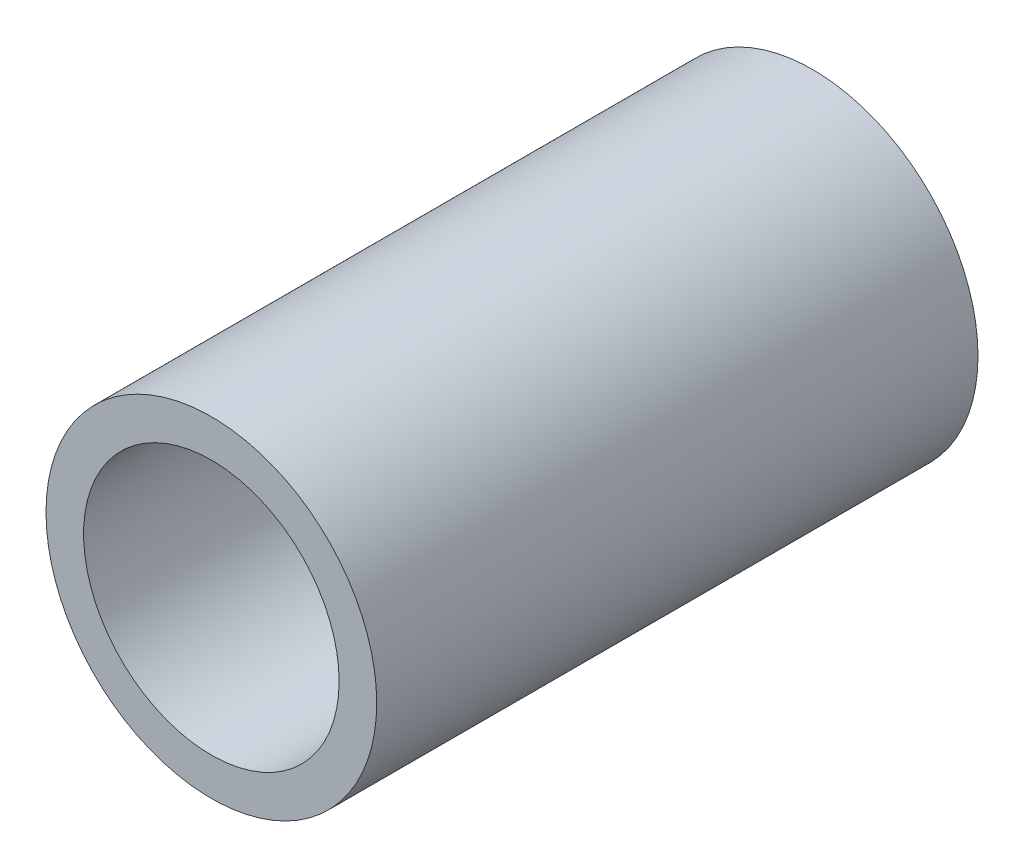
ISO-10303-21;
HEADER;
FILE_DESCRIPTION(('STEP AP214'),'2;1');
FILE_NAME('part.step','',(''),(''),'','','');
FILE_SCHEMA(('AUTOMOTIVE_DESIGN { 1 0 10303 214 1 1 1 1 }'));
ENDSEC;
DATA;
#1=APPLICATION_CONTEXT('core data for automotive mechanical design processes');
#2=APPLICATION_PROTOCOL_DEFINITION('international standard','automotive_design',2000,#1);
#3=PRODUCT_CONTEXT('',#1,'mechanical');
#4=PRODUCT('Part','Part','',(#3));
#5=PRODUCT_RELATED_PRODUCT_CATEGORY('part','',(#4));
#6=PRODUCT_DEFINITION_FORMATION('','',#4);
#7=PRODUCT_DEFINITION_CONTEXT('part definition',#1,'design');
#8=PRODUCT_DEFINITION('design','',#6,#7);
#9=PRODUCT_DEFINITION_SHAPE('','',#8);
#10=(LENGTH_UNIT() NAMED_UNIT(*) SI_UNIT(.MILLI.,.METRE.));
#11=(NAMED_UNIT(*) PLANE_ANGLE_UNIT() SI_UNIT($,.RADIAN.));
#12=(NAMED_UNIT(*) SI_UNIT($,.STERADIAN.) SOLID_ANGLE_UNIT());
#13=UNCERTAINTY_MEASURE_WITH_UNIT(LENGTH_MEASURE(1.E-05),#10,'distance_accuracy_value','');
#14=(GEOMETRIC_REPRESENTATION_CONTEXT(3) GLOBAL_UNCERTAINTY_ASSIGNED_CONTEXT((#13)) GLOBAL_UNIT_ASSIGNED_CONTEXT((#10,
#11,#12)) REPRESENTATION_CONTEXT('',''));
#15=CARTESIAN_POINT('',(0.,0.,0.));
#16=DIRECTION('',(0.,0.,1.));
#17=DIRECTION('',(1.,0.,0.));
#18=AXIS2_PLACEMENT_3D('',#15,#16,#17);
#19=CARTESIAN_POINT('',(0.,0.,40.));
#20=DIRECTION('',(0.,0.,1.));
#21=DIRECTION('',(1.,0.,0.));
#22=AXIS2_PLACEMENT_3D('',#19,#20,#21);
#23=PLANE('',#22);
#24=CARTESIAN_POINT('',(0.,0.,40.));
#25=DIRECTION('',(0.,0.,1.));
#26=DIRECTION('',(1.,0.,0.));
#27=AXIS2_PLACEMENT_3D('',#24,#25,#26);
#28=CIRCLE('',#27,11.);
#29=CARTESIAN_POINT('',(11.,0.,40.));
#30=VERTEX_POINT('',#29);
#31=EDGE_CURVE('E10',#30,#30,#28,.T.);
#32=ORIENTED_EDGE('',*,*,#31,.T.);
#33=EDGE_LOOP('',(#32));
#34=FACE_BOUND('',#33,.T.);
#35=CARTESIAN_POINT('',(0.,0.,40.));
#36=DIRECTION('',(0.,0.,1.));
#37=DIRECTION('',(1.,0.,0.));
#38=AXIS2_PLACEMENT_3D('',#35,#36,#37);
#39=CIRCLE('',#38,8.5);
#40=CARTESIAN_POINT('',(8.5,0.,40.));
#41=VERTEX_POINT('',#40);
#42=EDGE_CURVE('E41',#41,#41,#39,.T.);
#43=ORIENTED_EDGE('',*,*,#42,.F.);
#44=EDGE_LOOP('',(#43));
#45=FACE_BOUND('',#44,.T.);
#46=ADVANCED_FACE('F30',(#34,#45),#23,.T.);
#47=CARTESIAN_POINT('',(0.,0.,0.));
#48=DIRECTION('',(0.,0.,1.));
#49=DIRECTION('',(1.,0.,0.));
#50=AXIS2_PLACEMENT_3D('',#47,#48,#49);
#51=PLANE('',#50);
#52=CARTESIAN_POINT('',(0.,0.,0.));
#53=DIRECTION('',(0.,0.,1.));
#54=DIRECTION('',(1.,0.,0.));
#55=AXIS2_PLACEMENT_3D('',#52,#53,#54);
#56=CIRCLE('',#55,11.);
#57=CARTESIAN_POINT('',(11.,0.,0.));
#58=VERTEX_POINT('',#57);
#59=EDGE_CURVE('E34',#58,#58,#56,.T.);
#60=ORIENTED_EDGE('',*,*,#59,.F.);
#61=EDGE_LOOP('',(#60));
#62=FACE_BOUND('',#61,.T.);
#63=CARTESIAN_POINT('',(0.,0.,0.));
#64=DIRECTION('',(0.,0.,1.));
#65=DIRECTION('',(1.,0.,0.));
#66=AXIS2_PLACEMENT_3D('',#63,#64,#65);
#67=CIRCLE('',#66,8.5);
#68=CARTESIAN_POINT('',(8.5,0.,0.));
#69=VERTEX_POINT('',#68);
#70=EDGE_CURVE('E43',#69,#69,#67,.T.);
#71=ORIENTED_EDGE('',*,*,#70,.T.);
#72=EDGE_LOOP('',(#71));
#73=FACE_BOUND('',#72,.T.);
#74=ADVANCED_FACE('F53',(#62,#73),#51,.F.);
#75=CARTESIAN_POINT('',(0.,0.,40.));
#76=DIRECTION('',(0.,0.,-1.));
#77=DIRECTION('',(-1.,0.,0.));
#78=AXIS2_PLACEMENT_3D('',#75,#76,#77);
#79=CYLINDRICAL_SURFACE('',#78,11.);
#80=ORIENTED_EDGE('',*,*,#31,.F.);
#81=EDGE_LOOP('',(#80));
#82=FACE_BOUND('',#81,.T.);
#83=ORIENTED_EDGE('',*,*,#59,.T.);
#84=EDGE_LOOP('',(#83));
#85=FACE_BOUND('',#84,.T.);
#86=ADVANCED_FACE('F32',(#82,#85),#79,.T.);
#87=CARTESIAN_POINT('',(0.,0.,40.));
#88=DIRECTION('',(0.,0.,-1.));
#89=DIRECTION('',(-1.,0.,0.));
#90=AXIS2_PLACEMENT_3D('',#87,#88,#89);
#91=CYLINDRICAL_SURFACE('',#90,8.5);
#92=ORIENTED_EDGE('',*,*,#42,.T.);
#93=EDGE_LOOP('',(#92));
#94=FACE_BOUND('',#93,.T.);
#95=ORIENTED_EDGE('',*,*,#70,.F.);
#96=EDGE_LOOP('',(#95));
#97=FACE_BOUND('',#96,.T.);
#98=ADVANCED_FACE('F49',(#94,#97),#91,.F.);
#99=CLOSED_SHELL('',(#46,#74,#86,#98));
#100=MANIFOLD_SOLID_BREP('B2',#99);
#101=ADVANCED_BREP_SHAPE_REPRESENTATION('',(#18,#100),#14);
#102=SHAPE_DEFINITION_REPRESENTATION(#9,#101);
ENDSEC;
END-ISO-10303-21;
